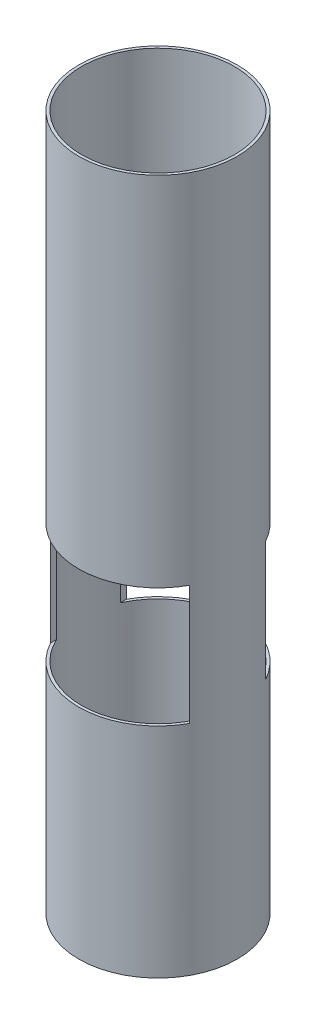
ISO-10303-21;
HEADER;
FILE_DESCRIPTION(('STEP AP214'),'2;1');
FILE_NAME('part.step','',(''),(''),'','','');
FILE_SCHEMA(('AUTOMOTIVE_DESIGN { 1 0 10303 214 1 1 1 1 }'));
ENDSEC;
DATA;
#1=APPLICATION_CONTEXT('core data for automotive mechanical design processes');
#2=APPLICATION_PROTOCOL_DEFINITION('international standard','automotive_design',2000,#1);
#3=PRODUCT_CONTEXT('',#1,'mechanical');
#4=PRODUCT('Part','Part','',(#3));
#5=PRODUCT_RELATED_PRODUCT_CATEGORY('part','',(#4));
#6=PRODUCT_DEFINITION_FORMATION('','',#4);
#7=PRODUCT_DEFINITION_CONTEXT('part definition',#1,'design');
#8=PRODUCT_DEFINITION('design','',#6,#7);
#9=PRODUCT_DEFINITION_SHAPE('','',#8);
#10=(LENGTH_UNIT() NAMED_UNIT(*) SI_UNIT(.MILLI.,.METRE.));
#11=(NAMED_UNIT(*) PLANE_ANGLE_UNIT() SI_UNIT($,.RADIAN.));
#12=(NAMED_UNIT(*) SI_UNIT($,.STERADIAN.) SOLID_ANGLE_UNIT());
#13=UNCERTAINTY_MEASURE_WITH_UNIT(LENGTH_MEASURE(1.E-05),#10,'distance_accuracy_value','');
#14=(GEOMETRIC_REPRESENTATION_CONTEXT(3) GLOBAL_UNCERTAINTY_ASSIGNED_CONTEXT((#13)) GLOBAL_UNIT_ASSIGNED_CONTEXT((#10,
#11,#12)) REPRESENTATION_CONTEXT('',''));
#15=CARTESIAN_POINT('',(0.,0.,0.));
#16=DIRECTION('',(0.,0.,1.));
#17=DIRECTION('',(1.,0.,0.));
#18=AXIS2_PLACEMENT_3D('',#15,#16,#17);
#19=CARTESIAN_POINT('',(0.,500.,0.));
#20=DIRECTION('',(0.,-1.,0.));
#21=DIRECTION('',(0.,0.,-1.));
#22=AXIS2_PLACEMENT_3D('',#19,#20,#21);
#23=CYLINDRICAL_SURFACE('',#22,57.);
#24=CARTESIAN_POINT('',(0.,157.,0.));
#25=DIRECTION('',(0.,1.,0.));
#26=DIRECTION('',(0.,0.,1.));
#27=AXIS2_PLACEMENT_3D('',#24,#25,#26);
#28=CIRCLE('',#27,57.);
#29=CARTESIAN_POINT('',(-50.,157.,27.3678643668081));
#30=VERTEX_POINT('',#29);
#31=CARTESIAN_POINT('',(50.,157.,27.367864366808));
#32=VERTEX_POINT('',#31);
#33=EDGE_CURVE('E173',#30,#32,#28,.T.);
#34=ORIENTED_EDGE('',*,*,#33,.F.);
#35=DIRECTION('',(0.,-1.,0.));
#36=VECTOR('',#35,1.);
#37=CARTESIAN_POINT('',(-50.,500.,27.367864366808));
#38=LINE('',#37,#36);
#39=CARTESIAN_POINT('',(-50.,243.,27.367864366808));
#40=VERTEX_POINT('',#39);
#41=EDGE_CURVE('E119',#40,#30,#38,.T.);
#42=ORIENTED_EDGE('',*,*,#41,.F.);
#43=CARTESIAN_POINT('',(0.,243.,0.));
#44=DIRECTION('',(0.,-1.,0.));
#45=DIRECTION('',(0.,0.,-1.));
#46=AXIS2_PLACEMENT_3D('',#43,#44,#45);
#47=CIRCLE('',#46,57.);
#48=CARTESIAN_POINT('',(50.,243.,27.367864366808));
#49=VERTEX_POINT('',#48);
#50=EDGE_CURVE('E110',#49,#40,#47,.T.);
#51=ORIENTED_EDGE('',*,*,#50,.F.);
#52=DIRECTION('',(0.,-1.,0.));
#53=VECTOR('',#52,1.);
#54=CARTESIAN_POINT('',(50.,500.,27.367864366808));
#55=LINE('',#54,#53);
#56=EDGE_CURVE('E97',#32,#49,#55,.F.);
#57=ORIENTED_EDGE('',*,*,#56,.F.);
#58=EDGE_LOOP('',(#34,#42,#51,#57));
#59=FACE_BOUND('',#58,.T.);
#60=CARTESIAN_POINT('',(0.,0.,0.));
#61=DIRECTION('',(0.,1.,0.));
#62=DIRECTION('',(0.,0.,1.));
#63=AXIS2_PLACEMENT_3D('',#60,#61,#62);
#64=CIRCLE('',#63,57.);
#65=CARTESIAN_POINT('',(0.,0.,57.));
#66=VERTEX_POINT('',#65);
#67=EDGE_CURVE('E130',#66,#66,#64,.T.);
#68=ORIENTED_EDGE('',*,*,#67,.T.);
#69=EDGE_LOOP('',(#68));
#70=FACE_BOUND('',#69,.T.);
#71=CARTESIAN_POINT('',(0.,500.,0.));
#72=DIRECTION('',(0.,1.,0.));
#73=DIRECTION('',(0.,0.,1.));
#74=AXIS2_PLACEMENT_3D('',#71,#72,#73);
#75=CIRCLE('',#74,57.);
#76=CARTESIAN_POINT('',(0.,500.,57.));
#77=VERTEX_POINT('',#76);
#78=EDGE_CURVE('E132',#77,#77,#75,.T.);
#79=ORIENTED_EDGE('',*,*,#78,.F.);
#80=EDGE_LOOP('',(#79));
#81=FACE_BOUND('',#80,.T.);
#82=CARTESIAN_POINT('',(-50.,243.,-27.367864366808));
#83=VERTEX_POINT('',#82);
#84=CARTESIAN_POINT('',(50.,243.,-27.367864366808));
#85=VERTEX_POINT('',#84);
#86=EDGE_CURVE('E121',#83,#85,#47,.T.);
#87=ORIENTED_EDGE('',*,*,#86,.F.);
#88=DIRECTION('',(0.,-1.,0.));
#89=VECTOR('',#88,1.);
#90=CARTESIAN_POINT('',(-50.,500.,-27.367864366808));
#91=LINE('',#90,#89);
#92=CARTESIAN_POINT('',(-50.,157.,-27.3678643668081));
#93=VERTEX_POINT('',#92);
#94=EDGE_CURVE('E174',#93,#83,#91,.F.);
#95=ORIENTED_EDGE('',*,*,#94,.F.);
#96=CARTESIAN_POINT('',(50.,157.,-27.367864366808));
#97=VERTEX_POINT('',#96);
#98=EDGE_CURVE('E165',#97,#93,#28,.T.);
#99=ORIENTED_EDGE('',*,*,#98,.F.);
#100=DIRECTION('',(0.,-1.,0.));
#101=VECTOR('',#100,1.);
#102=CARTESIAN_POINT('',(50.,500.,-27.367864366808));
#103=LINE('',#102,#101);
#104=EDGE_CURVE('E104',#85,#97,#103,.T.);
#105=ORIENTED_EDGE('',*,*,#104,.F.);
#106=EDGE_LOOP('',(#87,#95,#99,#105));
#107=FACE_BOUND('',#106,.T.);
#108=ADVANCED_FACE('F33',(#59,#70,#81,#107),#23,.T.);
#109=CARTESIAN_POINT('',(0.,500.,0.));
#110=DIRECTION('',(0.,-1.,0.));
#111=DIRECTION('',(0.,0.,-1.));
#112=AXIS2_PLACEMENT_3D('',#109,#110,#111);
#113=CYLINDRICAL_SURFACE('',#112,55.);
#114=CARTESIAN_POINT('',(0.,500.,0.));
#115=DIRECTION('',(0.,1.,0.));
#116=DIRECTION('',(0.,0.,1.));
#117=AXIS2_PLACEMENT_3D('',#114,#115,#116);
#118=CIRCLE('',#117,55.);
#119=CARTESIAN_POINT('',(0.,500.,55.));
#120=VERTEX_POINT('',#119);
#121=EDGE_CURVE('E124',#120,#120,#118,.T.);
#122=ORIENTED_EDGE('',*,*,#121,.T.);
#123=EDGE_LOOP('',(#122));
#124=FACE_BOUND('',#123,.T.);
#125=CARTESIAN_POINT('',(0.,0.,0.));
#126=DIRECTION('',(0.,1.,0.));
#127=DIRECTION('',(0.,0.,1.));
#128=AXIS2_PLACEMENT_3D('',#125,#126,#127);
#129=CIRCLE('',#128,55.);
#130=CARTESIAN_POINT('',(0.,0.,55.));
#131=VERTEX_POINT('',#130);
#132=EDGE_CURVE('E120',#131,#131,#129,.T.);
#133=ORIENTED_EDGE('',*,*,#132,.F.);
#134=EDGE_LOOP('',(#133));
#135=FACE_BOUND('',#134,.T.);
#136=DIRECTION('',(0.,-1.,0.));
#137=VECTOR('',#136,1.);
#138=CARTESIAN_POINT('',(50.,500.,22.9128784747792));
#139=LINE('',#138,#137);
#140=CARTESIAN_POINT('',(50.,157.,22.9128784747792));
#141=VERTEX_POINT('',#140);
#142=CARTESIAN_POINT('',(50.,243.,22.9128784747792));
#143=VERTEX_POINT('',#142);
#144=EDGE_CURVE('E135',#141,#143,#139,.F.);
#145=ORIENTED_EDGE('',*,*,#144,.T.);
#146=CARTESIAN_POINT('',(0.,243.,0.));
#147=DIRECTION('',(0.,-1.,0.));
#148=DIRECTION('',(0.,0.,-1.));
#149=AXIS2_PLACEMENT_3D('',#146,#147,#148);
#150=CIRCLE('',#149,55.);
#151=CARTESIAN_POINT('',(-50.,243.,22.9128784747791));
#152=VERTEX_POINT('',#151);
#153=EDGE_CURVE('E42',#143,#152,#150,.T.);
#154=ORIENTED_EDGE('',*,*,#153,.T.);
#155=DIRECTION('',(0.,-1.,0.));
#156=VECTOR('',#155,1.);
#157=CARTESIAN_POINT('',(-50.,500.,22.9128784747791));
#158=LINE('',#157,#156);
#159=CARTESIAN_POINT('',(-50.,157.,22.9128784747793));
#160=VERTEX_POINT('',#159);
#161=EDGE_CURVE('E142',#152,#160,#158,.T.);
#162=ORIENTED_EDGE('',*,*,#161,.T.);
#163=CARTESIAN_POINT('',(0.,157.,0.));
#164=DIRECTION('',(0.,1.,0.));
#165=DIRECTION('',(0.,0.,1.));
#166=AXIS2_PLACEMENT_3D('',#163,#164,#165);
#167=CIRCLE('',#166,55.);
#168=EDGE_CURVE('E139',#160,#141,#167,.T.);
#169=ORIENTED_EDGE('',*,*,#168,.T.);
#170=EDGE_LOOP('',(#145,#154,#162,#169));
#171=FACE_BOUND('',#170,.T.);
#172=DIRECTION('',(0.,-1.,0.));
#173=VECTOR('',#172,1.);
#174=CARTESIAN_POINT('',(-50.,500.,-22.9128784747791));
#175=LINE('',#174,#173);
#176=CARTESIAN_POINT('',(-50.,157.,-22.9128784747793));
#177=VERTEX_POINT('',#176);
#178=CARTESIAN_POINT('',(-50.,243.,-22.9128784747791));
#179=VERTEX_POINT('',#178);
#180=EDGE_CURVE('E36',#177,#179,#175,.F.);
#181=ORIENTED_EDGE('',*,*,#180,.T.);
#182=CARTESIAN_POINT('',(50.,243.,-22.9128784747792));
#183=VERTEX_POINT('',#182);
#184=EDGE_CURVE('E11',#179,#183,#150,.T.);
#185=ORIENTED_EDGE('',*,*,#184,.T.);
#186=DIRECTION('',(0.,-1.,0.));
#187=VECTOR('',#186,1.);
#188=CARTESIAN_POINT('',(50.,500.,-22.9128784747792));
#189=LINE('',#188,#187);
#190=CARTESIAN_POINT('',(50.,157.,-22.9128784747792));
#191=VERTEX_POINT('',#190);
#192=EDGE_CURVE('E145',#183,#191,#189,.T.);
#193=ORIENTED_EDGE('',*,*,#192,.T.);
#194=EDGE_CURVE('E143',#191,#177,#167,.T.);
#195=ORIENTED_EDGE('',*,*,#194,.T.);
#196=EDGE_LOOP('',(#181,#185,#193,#195));
#197=FACE_BOUND('',#196,.T.);
#198=ADVANCED_FACE('F151',(#124,#135,#171,#197),#113,.F.);
#199=CARTESIAN_POINT('',(0.,500.,0.));
#200=DIRECTION('',(0.,1.,0.));
#201=DIRECTION('',(0.,0.,1.));
#202=AXIS2_PLACEMENT_3D('',#199,#200,#201);
#203=PLANE('',#202);
#204=ORIENTED_EDGE('',*,*,#78,.T.);
#205=EDGE_LOOP('',(#204));
#206=FACE_BOUND('',#205,.T.);
#207=ORIENTED_EDGE('',*,*,#121,.F.);
#208=EDGE_LOOP('',(#207));
#209=FACE_BOUND('',#208,.T.);
#210=ADVANCED_FACE('F182',(#206,#209),#203,.T.);
#211=CARTESIAN_POINT('',(0.,0.,0.));
#212=DIRECTION('',(0.,1.,0.));
#213=DIRECTION('',(0.,0.,1.));
#214=AXIS2_PLACEMENT_3D('',#211,#212,#213);
#215=PLANE('',#214);
#216=ORIENTED_EDGE('',*,*,#67,.F.);
#217=EDGE_LOOP('',(#216));
#218=FACE_BOUND('',#217,.T.);
#219=ORIENTED_EDGE('',*,*,#132,.T.);
#220=EDGE_LOOP('',(#219));
#221=FACE_BOUND('',#220,.T.);
#222=ADVANCED_FACE('F189',(#218,#221),#215,.F.);
#223=CARTESIAN_POINT('',(50.,243.,-57.));
#224=DIRECTION('',(-1.,0.,0.));
#225=DIRECTION('',(0.,0.,1.));
#226=AXIS2_PLACEMENT_3D('',#223,#224,#225);
#227=PLANE('',#226);
#228=ORIENTED_EDGE('',*,*,#56,.T.);
#229=DIRECTION('',(0.,0.,-1.));
#230=VECTOR('',#229,1.);
#231=CARTESIAN_POINT('',(50.,243.,-57.));
#232=LINE('',#231,#230);
#233=EDGE_CURVE('E100',#49,#143,#232,.T.);
#234=ORIENTED_EDGE('',*,*,#233,.T.);
#235=ORIENTED_EDGE('',*,*,#144,.F.);
#236=DIRECTION('',(0.,0.,-1.));
#237=VECTOR('',#236,1.);
#238=CARTESIAN_POINT('',(50.,157.,-57.));
#239=LINE('',#238,#237);
#240=EDGE_CURVE('E57',#32,#141,#239,.T.);
#241=ORIENTED_EDGE('',*,*,#240,.F.);
#242=EDGE_LOOP('',(#228,#234,#235,#241));
#243=FACE_BOUND('',#242,.T.);
#244=ADVANCED_FACE('F99',(#243),#227,.T.);
#245=CARTESIAN_POINT('',(-50.,157.,-57.));
#246=DIRECTION('',(0.,1.,0.));
#247=DIRECTION('',(0.,0.,1.));
#248=AXIS2_PLACEMENT_3D('',#245,#246,#247);
#249=PLANE('',#248);
#250=ORIENTED_EDGE('',*,*,#33,.T.);
#251=ORIENTED_EDGE('',*,*,#240,.T.);
#252=ORIENTED_EDGE('',*,*,#168,.F.);
#253=DIRECTION('',(0.,0.,-1.));
#254=VECTOR('',#253,1.);
#255=CARTESIAN_POINT('',(-50.,157.,-57.));
#256=LINE('',#255,#254);
#257=EDGE_CURVE('E166',#30,#160,#256,.T.);
#258=ORIENTED_EDGE('',*,*,#257,.F.);
#259=EDGE_LOOP('',(#250,#251,#252,#258));
#260=FACE_BOUND('',#259,.T.);
#261=ADVANCED_FACE('F179',(#260),#249,.T.);
#262=CARTESIAN_POINT('',(-50.,243.,-57.));
#263=DIRECTION('',(1.,0.,0.));
#264=DIRECTION('',(0.,1.,0.));
#265=AXIS2_PLACEMENT_3D('',#262,#263,#264);
#266=PLANE('',#265);
#267=ORIENTED_EDGE('',*,*,#41,.T.);
#268=ORIENTED_EDGE('',*,*,#257,.T.);
#269=ORIENTED_EDGE('',*,*,#161,.F.);
#270=DIRECTION('',(0.,0.,-1.));
#271=VECTOR('',#270,1.);
#272=CARTESIAN_POINT('',(-50.,243.,-57.));
#273=LINE('',#272,#271);
#274=EDGE_CURVE('E105',#40,#152,#273,.T.);
#275=ORIENTED_EDGE('',*,*,#274,.F.);
#276=EDGE_LOOP('',(#267,#268,#269,#275));
#277=FACE_BOUND('',#276,.T.);
#278=ADVANCED_FACE('F177',(#277),#266,.T.);
#279=CARTESIAN_POINT('',(-50.,243.,-57.));
#280=DIRECTION('',(0.,-1.,0.));
#281=DIRECTION('',(0.,0.,-1.));
#282=AXIS2_PLACEMENT_3D('',#279,#280,#281);
#283=PLANE('',#282);
#284=ORIENTED_EDGE('',*,*,#50,.T.);
#285=ORIENTED_EDGE('',*,*,#274,.T.);
#286=ORIENTED_EDGE('',*,*,#153,.F.);
#287=ORIENTED_EDGE('',*,*,#233,.F.);
#288=EDGE_LOOP('',(#284,#285,#286,#287));
#289=FACE_BOUND('',#288,.T.);
#290=ADVANCED_FACE('F108',(#289),#283,.T.);
#291=ORIENTED_EDGE('',*,*,#86,.T.);
#292=EDGE_CURVE('E49',#183,#85,#232,.T.);
#293=ORIENTED_EDGE('',*,*,#292,.F.);
#294=ORIENTED_EDGE('',*,*,#184,.F.);
#295=EDGE_CURVE('E160',#179,#83,#273,.T.);
#296=ORIENTED_EDGE('',*,*,#295,.T.);
#297=EDGE_LOOP('',(#291,#293,#294,#296));
#298=FACE_BOUND('',#297,.T.);
#299=ADVANCED_FACE('F211',(#298),#283,.T.);
#300=ORIENTED_EDGE('',*,*,#94,.T.);
#301=ORIENTED_EDGE('',*,*,#295,.F.);
#302=ORIENTED_EDGE('',*,*,#180,.F.);
#303=EDGE_CURVE('E157',#177,#93,#256,.T.);
#304=ORIENTED_EDGE('',*,*,#303,.T.);
#305=EDGE_LOOP('',(#300,#301,#302,#304));
#306=FACE_BOUND('',#305,.T.);
#307=ADVANCED_FACE('F156',(#306),#266,.T.);
#308=ORIENTED_EDGE('',*,*,#98,.T.);
#309=ORIENTED_EDGE('',*,*,#303,.F.);
#310=ORIENTED_EDGE('',*,*,#194,.F.);
#311=EDGE_CURVE('E114',#191,#97,#239,.T.);
#312=ORIENTED_EDGE('',*,*,#311,.T.);
#313=EDGE_LOOP('',(#308,#309,#310,#312));
#314=FACE_BOUND('',#313,.T.);
#315=ADVANCED_FACE('F162',(#314),#249,.T.);
#316=ORIENTED_EDGE('',*,*,#104,.T.);
#317=ORIENTED_EDGE('',*,*,#311,.F.);
#318=ORIENTED_EDGE('',*,*,#192,.F.);
#319=ORIENTED_EDGE('',*,*,#292,.T.);
#320=EDGE_LOOP('',(#316,#317,#318,#319));
#321=FACE_BOUND('',#320,.T.);
#322=ADVANCED_FACE('F201',(#321),#227,.T.);
#323=CLOSED_SHELL('',(#108,#198,#210,#222,#244,#261,#278,#290,#299,#307,#315,#322));
#324=MANIFOLD_SOLID_BREP('B2',#323);
#325=ADVANCED_BREP_SHAPE_REPRESENTATION('',(#18,#324),#14);
#326=SHAPE_DEFINITION_REPRESENTATION(#9,#325);
ENDSEC;
END-ISO-10303-21;
